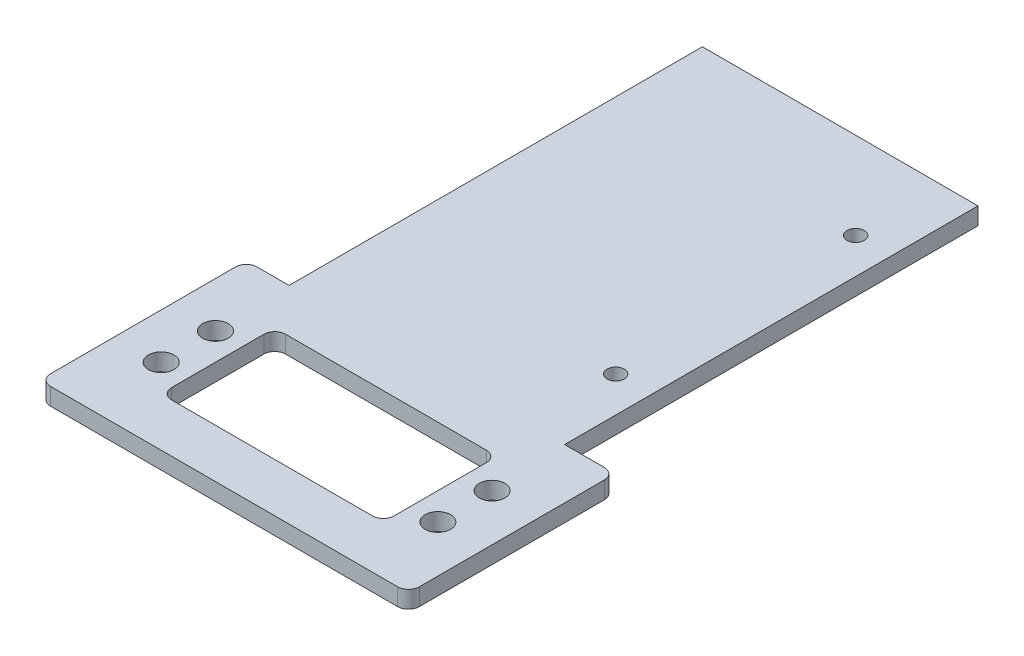
ISO-10303-21;
HEADER;
FILE_DESCRIPTION(('STEP AP214'),'2;1');
FILE_NAME('part.step','',(''),(''),'','','');
FILE_SCHEMA(('AUTOMOTIVE_DESIGN { 1 0 10303 214 1 1 1 1 }'));
ENDSEC;
DATA;
#1=APPLICATION_CONTEXT('core data for automotive mechanical design processes');
#2=APPLICATION_PROTOCOL_DEFINITION('international standard','automotive_design',2000,#1);
#3=PRODUCT_CONTEXT('',#1,'mechanical');
#4=PRODUCT('Part','Part','',(#3));
#5=PRODUCT_RELATED_PRODUCT_CATEGORY('part','',(#4));
#6=PRODUCT_DEFINITION_FORMATION('','',#4);
#7=PRODUCT_DEFINITION_CONTEXT('part definition',#1,'design');
#8=PRODUCT_DEFINITION('design','',#6,#7);
#9=PRODUCT_DEFINITION_SHAPE('','',#8);
#10=(LENGTH_UNIT() NAMED_UNIT(*) SI_UNIT(.MILLI.,.METRE.));
#11=(NAMED_UNIT(*) PLANE_ANGLE_UNIT() SI_UNIT($,.RADIAN.));
#12=(NAMED_UNIT(*) SI_UNIT($,.STERADIAN.) SOLID_ANGLE_UNIT());
#13=UNCERTAINTY_MEASURE_WITH_UNIT(LENGTH_MEASURE(1.E-05),#10,'distance_accuracy_value','');
#14=(GEOMETRIC_REPRESENTATION_CONTEXT(3) GLOBAL_UNCERTAINTY_ASSIGNED_CONTEXT((#13)) GLOBAL_UNIT_ASSIGNED_CONTEXT((#10,
#11,#12)) REPRESENTATION_CONTEXT('',''));
#15=CARTESIAN_POINT('',(0.,0.,0.));
#16=DIRECTION('',(0.,0.,1.));
#17=DIRECTION('',(1.,0.,0.));
#18=AXIS2_PLACEMENT_3D('',#15,#16,#17);
#19=CARTESIAN_POINT('',(-34.,3.175,19.05));
#20=DIRECTION('',(1.,0.,0.));
#21=DIRECTION('',(0.,0.,-1.));
#22=AXIS2_PLACEMENT_3D('',#19,#20,#21);
#23=PLANE('',#22);
#24=DIRECTION('',(0.,0.,1.));
#25=VECTOR('',#24,1.);
#26=CARTESIAN_POINT('',(-34.,3.175,19.05));
#27=LINE('',#26,#25);
#28=CARTESIAN_POINT('',(-34.,3.175,-17.05));
#29=VERTEX_POINT('',#28);
#30=CARTESIAN_POINT('',(-34.,3.175,17.05));
#31=VERTEX_POINT('',#30);
#32=EDGE_CURVE('E221',#29,#31,#27,.T.);
#33=ORIENTED_EDGE('',*,*,#32,.F.);
#34=DIRECTION('',(0.,-1.,0.));
#35=VECTOR('',#34,1.);
#36=CARTESIAN_POINT('',(-34.,3.175,-17.05));
#37=LINE('',#36,#35);
#38=CARTESIAN_POINT('',(-34.,0.,-17.05));
#39=VERTEX_POINT('',#38);
#40=EDGE_CURVE('E229',#29,#39,#37,.T.);
#41=ORIENTED_EDGE('',*,*,#40,.T.);
#42=DIRECTION('',(0.,0.,1.));
#43=VECTOR('',#42,1.);
#44=CARTESIAN_POINT('',(-34.,0.,19.05));
#45=LINE('',#44,#43);
#46=CARTESIAN_POINT('',(-34.,0.,17.05));
#47=VERTEX_POINT('',#46);
#48=EDGE_CURVE('E202',#39,#47,#45,.T.);
#49=ORIENTED_EDGE('',*,*,#48,.T.);
#50=DIRECTION('',(0.,-1.,0.));
#51=VECTOR('',#50,1.);
#52=CARTESIAN_POINT('',(-34.,3.175,17.05));
#53=LINE('',#52,#51);
#54=EDGE_CURVE('E186',#47,#31,#53,.F.);
#55=ORIENTED_EDGE('',*,*,#54,.T.);
#56=EDGE_LOOP('',(#33,#41,#49,#55));
#57=FACE_BOUND('',#56,.T.);
#58=ADVANCED_FACE('F32',(#57),#23,.F.);
#59=CARTESIAN_POINT('',(34.,3.175,19.05));
#60=DIRECTION('',(0.,0.,-1.));
#61=DIRECTION('',(-1.,0.,0.));
#62=AXIS2_PLACEMENT_3D('',#59,#60,#61);
#63=PLANE('',#62);
#64=DIRECTION('',(1.,0.,0.));
#65=VECTOR('',#64,1.);
#66=CARTESIAN_POINT('',(34.,0.,19.05));
#67=LINE('',#66,#65);
#68=CARTESIAN_POINT('',(-32.,0.,19.05));
#69=VERTEX_POINT('',#68);
#70=CARTESIAN_POINT('',(32.,0.,19.05));
#71=VERTEX_POINT('',#70);
#72=EDGE_CURVE('E205',#69,#71,#67,.T.);
#73=ORIENTED_EDGE('',*,*,#72,.T.);
#74=DIRECTION('',(0.,-1.,0.));
#75=VECTOR('',#74,1.);
#76=CARTESIAN_POINT('',(32.,3.175,19.05));
#77=LINE('',#76,#75);
#78=CARTESIAN_POINT('',(32.,3.175,19.05));
#79=VERTEX_POINT('',#78);
#80=EDGE_CURVE('E258',#71,#79,#77,.F.);
#81=ORIENTED_EDGE('',*,*,#80,.T.);
#82=DIRECTION('',(1.,0.,0.));
#83=VECTOR('',#82,1.);
#84=CARTESIAN_POINT('',(34.,3.175,19.05));
#85=LINE('',#84,#83);
#86=CARTESIAN_POINT('',(-32.,3.175,19.05));
#87=VERTEX_POINT('',#86);
#88=EDGE_CURVE('E353',#87,#79,#85,.T.);
#89=ORIENTED_EDGE('',*,*,#88,.F.);
#90=DIRECTION('',(0.,-1.,0.));
#91=VECTOR('',#90,1.);
#92=CARTESIAN_POINT('',(-32.,3.175,19.05));
#93=LINE('',#92,#91);
#94=EDGE_CURVE('E255',#87,#69,#93,.T.);
#95=ORIENTED_EDGE('',*,*,#94,.T.);
#96=EDGE_LOOP('',(#73,#81,#89,#95));
#97=FACE_BOUND('',#96,.T.);
#98=ADVANCED_FACE('F389',(#97),#63,.F.);
#99=CARTESIAN_POINT('',(34.,3.175,19.05));
#100=DIRECTION('',(-1.,0.,0.));
#101=DIRECTION('',(0.,0.,1.));
#102=AXIS2_PLACEMENT_3D('',#99,#100,#101);
#103=PLANE('',#102);
#104=DIRECTION('',(0.,0.,-1.));
#105=VECTOR('',#104,1.);
#106=CARTESIAN_POINT('',(34.,0.,19.05));
#107=LINE('',#106,#105);
#108=CARTESIAN_POINT('',(34.,0.,17.05));
#109=VERTEX_POINT('',#108);
#110=CARTESIAN_POINT('',(34.,0.,-17.05));
#111=VERTEX_POINT('',#110);
#112=EDGE_CURVE('E209',#109,#111,#107,.T.);
#113=ORIENTED_EDGE('',*,*,#112,.T.);
#114=DIRECTION('',(0.,-1.,0.));
#115=VECTOR('',#114,1.);
#116=CARTESIAN_POINT('',(34.,3.175,-17.05));
#117=LINE('',#116,#115);
#118=CARTESIAN_POINT('',(34.,3.175,-17.05));
#119=VERTEX_POINT('',#118);
#120=EDGE_CURVE('E55',#111,#119,#117,.F.);
#121=ORIENTED_EDGE('',*,*,#120,.T.);
#122=DIRECTION('',(0.,0.,-1.));
#123=VECTOR('',#122,1.);
#124=CARTESIAN_POINT('',(34.,3.175,19.05));
#125=LINE('',#124,#123);
#126=CARTESIAN_POINT('',(34.,3.175,17.05));
#127=VERTEX_POINT('',#126);
#128=EDGE_CURVE('E177',#127,#119,#125,.T.);
#129=ORIENTED_EDGE('',*,*,#128,.F.);
#130=DIRECTION('',(0.,-1.,0.));
#131=VECTOR('',#130,1.);
#132=CARTESIAN_POINT('',(34.,3.175,17.05));
#133=LINE('',#132,#131);
#134=EDGE_CURVE('E251',#127,#109,#133,.T.);
#135=ORIENTED_EDGE('',*,*,#134,.T.);
#136=EDGE_LOOP('',(#113,#121,#129,#135));
#137=FACE_BOUND('',#136,.T.);
#138=ADVANCED_FACE('F394',(#137),#103,.F.);
#139=CARTESIAN_POINT('',(34.,3.175,-19.05));
#140=DIRECTION('',(0.,0.,1.));
#141=DIRECTION('',(1.,0.,0.));
#142=AXIS2_PLACEMENT_3D('',#139,#140,#141);
#143=PLANE('',#142);
#144=DIRECTION('',(-1.,0.,0.));
#145=VECTOR('',#144,1.);
#146=CARTESIAN_POINT('',(34.,3.175,-19.05));
#147=LINE('',#146,#145);
#148=CARTESIAN_POINT('',(32.,3.175,-19.05));
#149=VERTEX_POINT('',#148);
#150=CARTESIAN_POINT('',(24.6845618434431,3.175,-19.05));
#151=VERTEX_POINT('',#150);
#152=EDGE_CURVE('E167',#149,#151,#147,.T.);
#153=ORIENTED_EDGE('',*,*,#152,.F.);
#154=DIRECTION('',(0.,-1.,0.));
#155=VECTOR('',#154,1.);
#156=CARTESIAN_POINT('',(32.,3.175,-19.05));
#157=LINE('',#156,#155);
#158=CARTESIAN_POINT('',(32.,0.,-19.05));
#159=VERTEX_POINT('',#158);
#160=EDGE_CURVE('E249',#149,#159,#157,.T.);
#161=ORIENTED_EDGE('',*,*,#160,.T.);
#162=DIRECTION('',(-1.,0.,0.));
#163=VECTOR('',#162,1.);
#164=CARTESIAN_POINT('',(34.,0.,-19.05));
#165=LINE('',#164,#163);
#166=CARTESIAN_POINT('',(24.6845618434431,0.,-19.05));
#167=VERTEX_POINT('',#166);
#168=EDGE_CURVE('E183',#159,#167,#165,.T.);
#169=ORIENTED_EDGE('',*,*,#168,.T.);
#170=DIRECTION('',(0.,-1.,0.));
#171=VECTOR('',#170,1.);
#172=CARTESIAN_POINT('',(24.6845618434431,3.175,-19.05));
#173=LINE('',#172,#171);
#174=EDGE_CURVE('E180',#151,#167,#173,.T.);
#175=ORIENTED_EDGE('',*,*,#174,.F.);
#176=EDGE_LOOP('',(#153,#161,#169,#175));
#177=FACE_BOUND('',#176,.T.);
#178=ADVANCED_FACE('F181',(#177),#143,.F.);
#179=CARTESIAN_POINT('',(24.6845618434431,3.175,-19.05));
#180=DIRECTION('',(-1.,0.,0.));
#181=DIRECTION('',(0.,0.,1.));
#182=AXIS2_PLACEMENT_3D('',#179,#180,#181);
#183=PLANE('',#182);
#184=DIRECTION('',(0.,0.,-1.));
#185=VECTOR('',#184,1.);
#186=CARTESIAN_POINT('',(24.6845618434431,0.,-19.05));
#187=LINE('',#186,#185);
#188=CARTESIAN_POINT('',(24.6845618434431,0.,-95.25));
#189=VERTEX_POINT('',#188);
#190=EDGE_CURVE('E212',#167,#189,#187,.T.);
#191=ORIENTED_EDGE('',*,*,#190,.T.);
#192=DIRECTION('',(0.,-1.,0.));
#193=VECTOR('',#192,1.);
#194=CARTESIAN_POINT('',(24.6845618434431,3.175,-95.25));
#195=LINE('',#194,#193);
#196=CARTESIAN_POINT('',(24.6845618434431,3.175,-95.25));
#197=VERTEX_POINT('',#196);
#198=EDGE_CURVE('E187',#197,#189,#195,.T.);
#199=ORIENTED_EDGE('',*,*,#198,.F.);
#200=DIRECTION('',(0.,0.,-1.));
#201=VECTOR('',#200,1.);
#202=CARTESIAN_POINT('',(24.6845618434431,3.175,-19.05));
#203=LINE('',#202,#201);
#204=EDGE_CURVE('E172',#151,#197,#203,.T.);
#205=ORIENTED_EDGE('',*,*,#204,.F.);
#206=ORIENTED_EDGE('',*,*,#174,.T.);
#207=EDGE_LOOP('',(#191,#199,#205,#206));
#208=FACE_BOUND('',#207,.T.);
#209=ADVANCED_FACE('F189',(#208),#183,.F.);
#210=CARTESIAN_POINT('',(-26.1154381565569,3.175,-95.25));
#211=DIRECTION('',(0.,0.,1.));
#212=DIRECTION('',(1.,0.,0.));
#213=AXIS2_PLACEMENT_3D('',#210,#211,#212);
#214=PLANE('',#213);
#215=DIRECTION('',(-1.,0.,0.));
#216=VECTOR('',#215,1.);
#217=CARTESIAN_POINT('',(-26.1154381565569,0.,-95.25));
#218=LINE('',#217,#216);
#219=CARTESIAN_POINT('',(-26.1154381565569,0.,-95.25));
#220=VERTEX_POINT('',#219);
#221=EDGE_CURVE('E214',#189,#220,#218,.T.);
#222=ORIENTED_EDGE('',*,*,#221,.T.);
#223=DIRECTION('',(0.,-1.,0.));
#224=VECTOR('',#223,1.);
#225=CARTESIAN_POINT('',(-26.1154381565569,3.175,-95.25));
#226=LINE('',#225,#224);
#227=CARTESIAN_POINT('',(-26.1154381565569,3.175,-95.25));
#228=VERTEX_POINT('',#227);
#229=EDGE_CURVE('E224',#228,#220,#226,.T.);
#230=ORIENTED_EDGE('',*,*,#229,.F.);
#231=DIRECTION('',(-1.,0.,0.));
#232=VECTOR('',#231,1.);
#233=CARTESIAN_POINT('',(-26.1154381565569,3.175,-95.25));
#234=LINE('',#233,#232);
#235=EDGE_CURVE('E192',#197,#228,#234,.T.);
#236=ORIENTED_EDGE('',*,*,#235,.F.);
#237=ORIENTED_EDGE('',*,*,#198,.T.);
#238=EDGE_LOOP('',(#222,#230,#236,#237));
#239=FACE_BOUND('',#238,.T.);
#240=ADVANCED_FACE('F365',(#239),#214,.F.);
#241=CARTESIAN_POINT('',(-26.1154381565569,3.175,-19.05));
#242=DIRECTION('',(1.,0.,0.));
#243=DIRECTION('',(0.,0.,-1.));
#244=AXIS2_PLACEMENT_3D('',#241,#242,#243);
#245=PLANE('',#244);
#246=DIRECTION('',(0.,0.,1.));
#247=VECTOR('',#246,1.);
#248=CARTESIAN_POINT('',(-26.1154381565569,0.,-19.05));
#249=LINE('',#248,#247);
#250=CARTESIAN_POINT('',(-26.1154381565569,0.,-19.05));
#251=VERTEX_POINT('',#250);
#252=EDGE_CURVE('E216',#220,#251,#249,.T.);
#253=ORIENTED_EDGE('',*,*,#252,.T.);
#254=DIRECTION('',(0.,-1.,0.));
#255=VECTOR('',#254,1.);
#256=CARTESIAN_POINT('',(-26.1154381565569,3.175,-19.05));
#257=LINE('',#256,#255);
#258=CARTESIAN_POINT('',(-26.1154381565569,3.175,-19.05));
#259=VERTEX_POINT('',#258);
#260=EDGE_CURVE('E201',#259,#251,#257,.T.);
#261=ORIENTED_EDGE('',*,*,#260,.F.);
#262=DIRECTION('',(0.,0.,1.));
#263=VECTOR('',#262,1.);
#264=CARTESIAN_POINT('',(-26.1154381565569,3.175,-19.05));
#265=LINE('',#264,#263);
#266=EDGE_CURVE('E194',#228,#259,#265,.T.);
#267=ORIENTED_EDGE('',*,*,#266,.F.);
#268=ORIENTED_EDGE('',*,*,#229,.T.);
#269=EDGE_LOOP('',(#253,#261,#267,#268));
#270=FACE_BOUND('',#269,.T.);
#271=ADVANCED_FACE('F372',(#270),#245,.F.);
#272=CARTESIAN_POINT('',(-26.1154381565569,3.175,-19.05));
#273=DIRECTION('',(0.,0.,1.));
#274=DIRECTION('',(1.,0.,0.));
#275=AXIS2_PLACEMENT_3D('',#272,#273,#274);
#276=PLANE('',#275);
#277=DIRECTION('',(-1.,0.,0.));
#278=VECTOR('',#277,1.);
#279=CARTESIAN_POINT('',(-26.1154381565569,0.,-19.05));
#280=LINE('',#279,#278);
#281=CARTESIAN_POINT('',(-32.,0.,-19.05));
#282=VERTEX_POINT('',#281);
#283=EDGE_CURVE('E218',#251,#282,#280,.T.);
#284=ORIENTED_EDGE('',*,*,#283,.T.);
#285=DIRECTION('',(0.,-1.,0.));
#286=VECTOR('',#285,1.);
#287=CARTESIAN_POINT('',(-32.,3.175,-19.05));
#288=LINE('',#287,#286);
#289=CARTESIAN_POINT('',(-32.,3.175,-19.05));
#290=VERTEX_POINT('',#289);
#291=EDGE_CURVE('E240',#282,#290,#288,.F.);
#292=ORIENTED_EDGE('',*,*,#291,.T.);
#293=DIRECTION('',(-1.,0.,0.));
#294=VECTOR('',#293,1.);
#295=CARTESIAN_POINT('',(-26.1154381565569,3.175,-19.05));
#296=LINE('',#295,#294);
#297=EDGE_CURVE('E199',#259,#290,#296,.T.);
#298=ORIENTED_EDGE('',*,*,#297,.F.);
#299=ORIENTED_EDGE('',*,*,#260,.T.);
#300=EDGE_LOOP('',(#284,#292,#298,#299));
#301=FACE_BOUND('',#300,.T.);
#302=ADVANCED_FACE('F375',(#301),#276,.F.);
#303=CARTESIAN_POINT('',(0.,3.175,0.));
#304=DIRECTION('',(0.,1.,0.));
#305=DIRECTION('',(0.,0.,1.));
#306=AXIS2_PLACEMENT_3D('',#303,#304,#305);
#307=PLANE('',#306);
#308=CARTESIAN_POINT('',(18.1345618434431,3.175,-79.248));
#309=DIRECTION('',(0.,1.,0.));
#310=DIRECTION('',(0.,0.,1.));
#311=AXIS2_PLACEMENT_3D('',#308,#309,#310);
#312=CIRCLE('',#311,1.5875);
#313=CARTESIAN_POINT('',(18.1345618434431,3.175,-77.6605));
#314=VERTEX_POINT('',#313);
#315=EDGE_CURVE('E617',#314,#314,#312,.T.);
#316=ORIENTED_EDGE('',*,*,#315,.F.);
#317=EDGE_LOOP('',(#316));
#318=FACE_BOUND('',#317,.T.);
#319=CARTESIAN_POINT('',(18.1345618434431,3.175,-34.998));
#320=DIRECTION('',(0.,1.,0.));
#321=DIRECTION('',(0.,0.,1.));
#322=AXIS2_PLACEMENT_3D('',#319,#320,#321);
#323=CIRCLE('',#322,1.5875);
#324=CARTESIAN_POINT('',(18.1345618434431,3.175,-33.4105));
#325=VERTEX_POINT('',#324);
#326=EDGE_CURVE('E622',#325,#325,#323,.T.);
#327=ORIENTED_EDGE('',*,*,#326,.F.);
#328=EDGE_LOOP('',(#327));
#329=FACE_BOUND('',#328,.T.);
#330=DIRECTION('',(0.,0.,1.));
#331=VECTOR('',#330,1.);
#332=CARTESIAN_POINT('',(-20.6404381565569,3.175,10.0597366167731));
#333=LINE('',#332,#331);
#334=CARTESIAN_POINT('',(-20.6404381565569,3.175,-8.94026338322691));
#335=VERTEX_POINT('',#334);
#336=CARTESIAN_POINT('',(-20.6404381565569,3.175,8.05973661677308));
#337=VERTEX_POINT('',#336);
#338=EDGE_CURVE('E298',#335,#337,#333,.T.);
#339=ORIENTED_EDGE('',*,*,#338,.F.);
#340=CARTESIAN_POINT('',(-18.6404381565569,3.175,-8.94026338322692));
#341=DIRECTION('',(0.,1.,0.));
#342=DIRECTION('',(0.,0.,1.));
#343=AXIS2_PLACEMENT_3D('',#340,#341,#342);
#344=CIRCLE('',#343,2.);
#345=CARTESIAN_POINT('',(-18.6404381565569,3.175,-10.9402633832269));
#346=VERTEX_POINT('',#345);
#347=EDGE_CURVE('E40',#335,#346,#344,.F.);
#348=ORIENTED_EDGE('',*,*,#347,.T.);
#349=DIRECTION('',(-1.,0.,0.));
#350=VECTOR('',#349,1.);
#351=CARTESIAN_POINT('',(20.3595618434431,3.175,-10.9402633832269));
#352=LINE('',#351,#350);
#353=CARTESIAN_POINT('',(18.3595618434431,3.175,-10.9402633832269));
#354=VERTEX_POINT('',#353);
#355=EDGE_CURVE('E296',#354,#346,#352,.T.);
#356=ORIENTED_EDGE('',*,*,#355,.F.);
#357=CARTESIAN_POINT('',(18.3595618434431,3.175,-8.94026338322692));
#358=DIRECTION('',(0.,1.,0.));
#359=DIRECTION('',(0.,0.,1.));
#360=AXIS2_PLACEMENT_3D('',#357,#358,#359);
#361=CIRCLE('',#360,2.);
#362=CARTESIAN_POINT('',(20.3595618434431,3.175,-8.94026338322692));
#363=VERTEX_POINT('',#362);
#364=EDGE_CURVE('E280',#354,#363,#361,.F.);
#365=ORIENTED_EDGE('',*,*,#364,.T.);
#366=DIRECTION('',(0.,0.,-1.));
#367=VECTOR('',#366,1.);
#368=CARTESIAN_POINT('',(20.3595618434431,3.175,10.0597366167731));
#369=LINE('',#368,#367);
#370=CARTESIAN_POINT('',(20.3595618434431,3.175,8.05973661677308));
#371=VERTEX_POINT('',#370);
#372=EDGE_CURVE('E308',#371,#363,#369,.T.);
#373=ORIENTED_EDGE('',*,*,#372,.F.);
#374=CARTESIAN_POINT('',(18.3595618434431,3.175,8.05973661677308));
#375=DIRECTION('',(0.,1.,0.));
#376=DIRECTION('',(0.,0.,1.));
#377=AXIS2_PLACEMENT_3D('',#374,#375,#376);
#378=CIRCLE('',#377,2.);
#379=CARTESIAN_POINT('',(18.3595618434431,3.175,10.0597366167731));
#380=VERTEX_POINT('',#379);
#381=EDGE_CURVE('E284',#371,#380,#378,.F.);
#382=ORIENTED_EDGE('',*,*,#381,.T.);
#383=DIRECTION('',(1.,0.,0.));
#384=VECTOR('',#383,1.);
#385=CARTESIAN_POINT('',(20.3595618434431,3.175,10.0597366167731));
#386=LINE('',#385,#384);
#387=CARTESIAN_POINT('',(-18.6404381565569,3.175,10.0597366167731));
#388=VERTEX_POINT('',#387);
#389=EDGE_CURVE('E335',#388,#380,#386,.T.);
#390=ORIENTED_EDGE('',*,*,#389,.F.);
#391=CARTESIAN_POINT('',(-18.6404381565569,3.175,8.05973661677308));
#392=DIRECTION('',(0.,1.,0.));
#393=DIRECTION('',(0.,0.,1.));
#394=AXIS2_PLACEMENT_3D('',#391,#392,#393);
#395=CIRCLE('',#394,2.);
#396=EDGE_CURVE('E288',#388,#337,#395,.F.);
#397=ORIENTED_EDGE('',*,*,#396,.T.);
#398=EDGE_LOOP('',(#339,#348,#356,#365,#373,#382,#390,#397));
#399=FACE_BOUND('',#398,.T.);
#400=CARTESIAN_POINT('',(25.3595618434431,3.175,5.));
#401=DIRECTION('',(0.,1.,0.));
#402=DIRECTION('',(0.,0.,-1.));
#403=AXIS2_PLACEMENT_3D('',#400,#401,#402);
#404=CIRCLE('',#403,2.35);
#405=CARTESIAN_POINT('',(25.3595618434431,3.175,2.65));
#406=VERTEX_POINT('',#405);
#407=EDGE_CURVE('E343',#406,#406,#404,.T.);
#408=ORIENTED_EDGE('',*,*,#407,.F.);
#409=EDGE_LOOP('',(#408));
#410=FACE_BOUND('',#409,.T.);
#411=CARTESIAN_POINT('',(-25.6404381565569,3.175,-5.));
#412=DIRECTION('',(0.,1.,0.));
#413=DIRECTION('',(0.,0.,1.));
#414=AXIS2_PLACEMENT_3D('',#411,#412,#413);
#415=CIRCLE('',#414,2.35);
#416=CARTESIAN_POINT('',(-25.6404381565569,3.175,-2.65));
#417=VERTEX_POINT('',#416);
#418=EDGE_CURVE('E629',#417,#417,#415,.T.);
#419=ORIENTED_EDGE('',*,*,#418,.F.);
#420=EDGE_LOOP('',(#419));
#421=FACE_BOUND('',#420,.T.);
#422=CARTESIAN_POINT('',(25.3595618434431,3.175,-5.));
#423=DIRECTION('',(0.,1.,0.));
#424=DIRECTION('',(0.,0.,-1.));
#425=AXIS2_PLACEMENT_3D('',#422,#423,#424);
#426=CIRCLE('',#425,2.35);
#427=CARTESIAN_POINT('',(25.3595618434431,3.175,-7.35));
#428=VERTEX_POINT('',#427);
#429=EDGE_CURVE('E328',#428,#428,#426,.T.);
#430=ORIENTED_EDGE('',*,*,#429,.F.);
#431=EDGE_LOOP('',(#430));
#432=FACE_BOUND('',#431,.T.);
#433=CARTESIAN_POINT('',(-25.6404381565569,3.175,5.));
#434=DIRECTION('',(0.,1.,0.));
#435=DIRECTION('',(0.,0.,1.));
#436=AXIS2_PLACEMENT_3D('',#433,#434,#435);
#437=CIRCLE('',#436,2.35);
#438=CARTESIAN_POINT('',(-25.6404381565569,3.175,7.35));
#439=VERTEX_POINT('',#438);
#440=EDGE_CURVE('E333',#439,#439,#437,.T.);
#441=ORIENTED_EDGE('',*,*,#440,.F.);
#442=EDGE_LOOP('',(#441));
#443=FACE_BOUND('',#442,.T.);
#444=ORIENTED_EDGE('',*,*,#297,.T.);
#445=CARTESIAN_POINT('',(-32.,3.175,-17.05));
#446=DIRECTION('',(0.,1.,0.));
#447=DIRECTION('',(0.,0.,1.));
#448=AXIS2_PLACEMENT_3D('',#445,#446,#447);
#449=CIRCLE('',#448,2.);
#450=EDGE_CURVE('E247',#290,#29,#449,.T.);
#451=ORIENTED_EDGE('',*,*,#450,.T.);
#452=ORIENTED_EDGE('',*,*,#32,.T.);
#453=CARTESIAN_POINT('',(-32.,3.175,17.05));
#454=DIRECTION('',(0.,1.,0.));
#455=DIRECTION('',(0.,0.,1.));
#456=AXIS2_PLACEMENT_3D('',#453,#454,#455);
#457=CIRCLE('',#456,2.);
#458=EDGE_CURVE('E242',#31,#87,#457,.T.);
#459=ORIENTED_EDGE('',*,*,#458,.T.);
#460=ORIENTED_EDGE('',*,*,#88,.T.);
#461=CARTESIAN_POINT('',(32.,3.175,17.05));
#462=DIRECTION('',(0.,1.,0.));
#463=DIRECTION('',(0.,0.,1.));
#464=AXIS2_PLACEMENT_3D('',#461,#462,#463);
#465=CIRCLE('',#464,2.);
#466=EDGE_CURVE('E244',#79,#127,#465,.T.);
#467=ORIENTED_EDGE('',*,*,#466,.T.);
#468=ORIENTED_EDGE('',*,*,#128,.T.);
#469=CARTESIAN_POINT('',(32.,3.175,-17.05));
#470=DIRECTION('',(0.,1.,0.));
#471=DIRECTION('',(0.,0.,1.));
#472=AXIS2_PLACEMENT_3D('',#469,#470,#471);
#473=CIRCLE('',#472,2.);
#474=EDGE_CURVE('E47',#119,#149,#473,.T.);
#475=ORIENTED_EDGE('',*,*,#474,.T.);
#476=ORIENTED_EDGE('',*,*,#152,.T.);
#477=ORIENTED_EDGE('',*,*,#204,.T.);
#478=ORIENTED_EDGE('',*,*,#235,.T.);
#479=ORIENTED_EDGE('',*,*,#266,.T.);
#480=EDGE_LOOP('',(#444,#451,#452,#459,#460,#467,#468,#475,#476,#477,#478,#479));
#481=FACE_BOUND('',#480,.T.);
#482=ADVANCED_FACE('F170',(#318,#329,#399,#410,#421,#432,#443,#481),#307,.T.);
#483=CARTESIAN_POINT('',(0.,0.,0.));
#484=DIRECTION('',(0.,1.,0.));
#485=DIRECTION('',(0.,0.,1.));
#486=AXIS2_PLACEMENT_3D('',#483,#484,#485);
#487=PLANE('',#486);
#488=CARTESIAN_POINT('',(18.1345618434431,0.,-79.248));
#489=DIRECTION('',(0.,1.,0.));
#490=DIRECTION('',(0.,0.,1.));
#491=AXIS2_PLACEMENT_3D('',#488,#489,#490);
#492=CIRCLE('',#491,1.5875);
#493=CARTESIAN_POINT('',(18.1345618434431,0.,-77.6605));
#494=VERTEX_POINT('',#493);
#495=EDGE_CURVE('E614',#494,#494,#492,.T.);
#496=ORIENTED_EDGE('',*,*,#495,.T.);
#497=EDGE_LOOP('',(#496));
#498=FACE_BOUND('',#497,.T.);
#499=CARTESIAN_POINT('',(18.1345618434431,0.,-34.998));
#500=DIRECTION('',(0.,1.,0.));
#501=DIRECTION('',(0.,0.,1.));
#502=AXIS2_PLACEMENT_3D('',#499,#500,#501);
#503=CIRCLE('',#502,1.5875);
#504=CARTESIAN_POINT('',(18.1345618434431,0.,-33.4105));
#505=VERTEX_POINT('',#504);
#506=EDGE_CURVE('E618',#505,#505,#503,.T.);
#507=ORIENTED_EDGE('',*,*,#506,.T.);
#508=EDGE_LOOP('',(#507));
#509=FACE_BOUND('',#508,.T.);
#510=DIRECTION('',(0.,0.,-1.));
#511=VECTOR('',#510,1.);
#512=CARTESIAN_POINT('',(20.3595618434431,0.,10.0597366167731));
#513=LINE('',#512,#511);
#514=CARTESIAN_POINT('',(20.3595618434431,0.,8.05973661677308));
#515=VERTEX_POINT('',#514);
#516=CARTESIAN_POINT('',(20.3595618434431,0.,-8.94026338322692));
#517=VERTEX_POINT('',#516);
#518=EDGE_CURVE('E325',#515,#517,#513,.T.);
#519=ORIENTED_EDGE('',*,*,#518,.T.);
#520=CARTESIAN_POINT('',(18.3595618434431,0.,-8.94026338322692));
#521=DIRECTION('',(0.,1.,0.));
#522=DIRECTION('',(0.,0.,1.));
#523=AXIS2_PLACEMENT_3D('',#520,#521,#522);
#524=CIRCLE('',#523,2.);
#525=CARTESIAN_POINT('',(18.3595618434431,0.,-10.9402633832269));
#526=VERTEX_POINT('',#525);
#527=EDGE_CURVE('E282',#517,#526,#524,.T.);
#528=ORIENTED_EDGE('',*,*,#527,.T.);
#529=DIRECTION('',(-1.,0.,0.));
#530=VECTOR('',#529,1.);
#531=CARTESIAN_POINT('',(20.3595618434431,0.,-10.9402633832269));
#532=LINE('',#531,#530);
#533=CARTESIAN_POINT('',(-18.6404381565569,0.,-10.9402633832269));
#534=VERTEX_POINT('',#533);
#535=EDGE_CURVE('E318',#526,#534,#532,.T.);
#536=ORIENTED_EDGE('',*,*,#535,.T.);
#537=CARTESIAN_POINT('',(-18.6404381565569,0.,-8.94026338322692));
#538=DIRECTION('',(0.,1.,0.));
#539=DIRECTION('',(0.,0.,1.));
#540=AXIS2_PLACEMENT_3D('',#537,#538,#539);
#541=CIRCLE('',#540,2.);
#542=CARTESIAN_POINT('',(-20.6404381565569,0.,-8.94026338322691));
#543=VERTEX_POINT('',#542);
#544=EDGE_CURVE('E11',#534,#543,#541,.T.);
#545=ORIENTED_EDGE('',*,*,#544,.T.);
#546=DIRECTION('',(0.,0.,1.));
#547=VECTOR('',#546,1.);
#548=CARTESIAN_POINT('',(-20.6404381565569,0.,10.0597366167731));
#549=LINE('',#548,#547);
#550=CARTESIAN_POINT('',(-20.6404381565569,0.,8.05973661677308));
#551=VERTEX_POINT('',#550);
#552=EDGE_CURVE('E307',#543,#551,#549,.T.);
#553=ORIENTED_EDGE('',*,*,#552,.T.);
#554=CARTESIAN_POINT('',(-18.6404381565569,0.,8.05973661677308));
#555=DIRECTION('',(0.,1.,0.));
#556=DIRECTION('',(0.,0.,1.));
#557=AXIS2_PLACEMENT_3D('',#554,#555,#556);
#558=CIRCLE('',#557,2.);
#559=CARTESIAN_POINT('',(-18.6404381565569,0.,10.0597366167731));
#560=VERTEX_POINT('',#559);
#561=EDGE_CURVE('E290',#551,#560,#558,.T.);
#562=ORIENTED_EDGE('',*,*,#561,.T.);
#563=DIRECTION('',(1.,0.,0.));
#564=VECTOR('',#563,1.);
#565=CARTESIAN_POINT('',(20.3595618434431,0.,10.0597366167731));
#566=LINE('',#565,#564);
#567=CARTESIAN_POINT('',(18.3595618434431,0.,10.0597366167731));
#568=VERTEX_POINT('',#567);
#569=EDGE_CURVE('E322',#560,#568,#566,.T.);
#570=ORIENTED_EDGE('',*,*,#569,.T.);
#571=CARTESIAN_POINT('',(18.3595618434431,0.,8.05973661677308));
#572=DIRECTION('',(0.,1.,0.));
#573=DIRECTION('',(0.,0.,1.));
#574=AXIS2_PLACEMENT_3D('',#571,#572,#573);
#575=CIRCLE('',#574,2.);
#576=EDGE_CURVE('E286',#568,#515,#575,.T.);
#577=ORIENTED_EDGE('',*,*,#576,.T.);
#578=EDGE_LOOP('',(#519,#528,#536,#545,#553,#562,#570,#577));
#579=FACE_BOUND('',#578,.T.);
#580=CARTESIAN_POINT('',(25.3595618434431,0.,5.));
#581=DIRECTION('',(0.,1.,0.));
#582=DIRECTION('',(0.,0.,-1.));
#583=AXIS2_PLACEMENT_3D('',#580,#581,#582);
#584=CIRCLE('',#583,2.35);
#585=CARTESIAN_POINT('',(25.3595618434431,0.,2.65));
#586=VERTEX_POINT('',#585);
#587=EDGE_CURVE('E336',#586,#586,#584,.T.);
#588=ORIENTED_EDGE('',*,*,#587,.T.);
#589=EDGE_LOOP('',(#588));
#590=FACE_BOUND('',#589,.T.);
#591=CARTESIAN_POINT('',(-25.6404381565569,0.,-5.));
#592=DIRECTION('',(0.,1.,0.));
#593=DIRECTION('',(0.,0.,1.));
#594=AXIS2_PLACEMENT_3D('',#591,#592,#593);
#595=CIRCLE('',#594,2.35);
#596=CARTESIAN_POINT('',(-25.6404381565569,0.,-2.65));
#597=VERTEX_POINT('',#596);
#598=EDGE_CURVE('E346',#597,#597,#595,.T.);
#599=ORIENTED_EDGE('',*,*,#598,.T.);
#600=EDGE_LOOP('',(#599));
#601=FACE_BOUND('',#600,.T.);
#602=CARTESIAN_POINT('',(25.3595618434431,0.,-5.));
#603=DIRECTION('',(0.,1.,0.));
#604=DIRECTION('',(0.,0.,-1.));
#605=AXIS2_PLACEMENT_3D('',#602,#603,#604);
#606=CIRCLE('',#605,2.35);
#607=CARTESIAN_POINT('',(25.3595618434431,0.,-7.35));
#608=VERTEX_POINT('',#607);
#609=EDGE_CURVE('E631',#608,#608,#606,.T.);
#610=ORIENTED_EDGE('',*,*,#609,.T.);
#611=EDGE_LOOP('',(#610));
#612=FACE_BOUND('',#611,.T.);
#613=CARTESIAN_POINT('',(-25.6404381565569,0.,5.));
#614=DIRECTION('',(0.,1.,0.));
#615=DIRECTION('',(0.,0.,1.));
#616=AXIS2_PLACEMENT_3D('',#613,#614,#615);
#617=CIRCLE('',#616,2.35);
#618=CARTESIAN_POINT('',(-25.6404381565569,0.,7.35));
#619=VERTEX_POINT('',#618);
#620=EDGE_CURVE('E206',#619,#619,#617,.T.);
#621=ORIENTED_EDGE('',*,*,#620,.T.);
#622=EDGE_LOOP('',(#621));
#623=FACE_BOUND('',#622,.T.);
#624=ORIENTED_EDGE('',*,*,#48,.F.);
#625=CARTESIAN_POINT('',(-32.,0.,-17.05));
#626=DIRECTION('',(0.,1.,0.));
#627=DIRECTION('',(0.,0.,1.));
#628=AXIS2_PLACEMENT_3D('',#625,#626,#627);
#629=CIRCLE('',#628,2.);
#630=EDGE_CURVE('E238',#39,#282,#629,.F.);
#631=ORIENTED_EDGE('',*,*,#630,.T.);
#632=ORIENTED_EDGE('',*,*,#283,.F.);
#633=ORIENTED_EDGE('',*,*,#252,.F.);
#634=ORIENTED_EDGE('',*,*,#221,.F.);
#635=ORIENTED_EDGE('',*,*,#190,.F.);
#636=ORIENTED_EDGE('',*,*,#168,.F.);
#637=CARTESIAN_POINT('',(32.,0.,-17.05));
#638=DIRECTION('',(0.,1.,0.));
#639=DIRECTION('',(0.,0.,1.));
#640=AXIS2_PLACEMENT_3D('',#637,#638,#639);
#641=CIRCLE('',#640,2.);
#642=EDGE_CURVE('E236',#159,#111,#641,.F.);
#643=ORIENTED_EDGE('',*,*,#642,.T.);
#644=ORIENTED_EDGE('',*,*,#112,.F.);
#645=CARTESIAN_POINT('',(32.,0.,17.05));
#646=DIRECTION('',(0.,1.,0.));
#647=DIRECTION('',(0.,0.,1.));
#648=AXIS2_PLACEMENT_3D('',#645,#646,#647);
#649=CIRCLE('',#648,2.);
#650=EDGE_CURVE('E234',#109,#71,#649,.F.);
#651=ORIENTED_EDGE('',*,*,#650,.T.);
#652=ORIENTED_EDGE('',*,*,#72,.F.);
#653=CARTESIAN_POINT('',(-32.,0.,17.05));
#654=DIRECTION('',(0.,1.,0.));
#655=DIRECTION('',(0.,0.,1.));
#656=AXIS2_PLACEMENT_3D('',#653,#654,#655);
#657=CIRCLE('',#656,2.);
#658=EDGE_CURVE('E232',#69,#47,#657,.F.);
#659=ORIENTED_EDGE('',*,*,#658,.T.);
#660=EDGE_LOOP('',(#624,#631,#632,#633,#634,#635,#636,#643,#644,#651,#652,#659));
#661=FACE_BOUND('',#660,.T.);
#662=ADVANCED_FACE('F315',(#498,#509,#579,#590,#601,#612,#623,#661),#487,.F.);
#663=CARTESIAN_POINT('',(-25.6404381565569,0.,5.));
#664=DIRECTION('',(0.,1.,0.));
#665=DIRECTION('',(0.,0.,1.));
#666=AXIS2_PLACEMENT_3D('',#663,#664,#665);
#667=CYLINDRICAL_SURFACE('',#666,2.35);
#668=ORIENTED_EDGE('',*,*,#620,.F.);
#669=EDGE_LOOP('',(#668));
#670=FACE_BOUND('',#669,.T.);
#671=ORIENTED_EDGE('',*,*,#440,.T.);
#672=EDGE_LOOP('',(#671));
#673=FACE_BOUND('',#672,.T.);
#674=ADVANCED_FACE('F461',(#670,#673),#667,.F.);
#675=CARTESIAN_POINT('',(25.3595618434431,0.,-5.));
#676=DIRECTION('',(0.,1.,0.));
#677=DIRECTION('',(0.,0.,1.));
#678=AXIS2_PLACEMENT_3D('',#675,#676,#677);
#679=CYLINDRICAL_SURFACE('',#678,2.35);
#680=ORIENTED_EDGE('',*,*,#609,.F.);
#681=EDGE_LOOP('',(#680));
#682=FACE_BOUND('',#681,.T.);
#683=ORIENTED_EDGE('',*,*,#429,.T.);
#684=EDGE_LOOP('',(#683));
#685=FACE_BOUND('',#684,.T.);
#686=ADVANCED_FACE('F464',(#682,#685),#679,.F.);
#687=CARTESIAN_POINT('',(-25.6404381565569,0.,-5.));
#688=DIRECTION('',(0.,1.,0.));
#689=DIRECTION('',(0.,0.,1.));
#690=AXIS2_PLACEMENT_3D('',#687,#688,#689);
#691=CYLINDRICAL_SURFACE('',#690,2.35);
#692=ORIENTED_EDGE('',*,*,#598,.F.);
#693=EDGE_LOOP('',(#692));
#694=FACE_BOUND('',#693,.T.);
#695=ORIENTED_EDGE('',*,*,#418,.T.);
#696=EDGE_LOOP('',(#695));
#697=FACE_BOUND('',#696,.T.);
#698=ADVANCED_FACE('F459',(#694,#697),#691,.F.);
#699=CARTESIAN_POINT('',(25.3595618434431,0.,5.));
#700=DIRECTION('',(0.,1.,0.));
#701=DIRECTION('',(0.,0.,1.));
#702=AXIS2_PLACEMENT_3D('',#699,#700,#701);
#703=CYLINDRICAL_SURFACE('',#702,2.35);
#704=ORIENTED_EDGE('',*,*,#587,.F.);
#705=EDGE_LOOP('',(#704));
#706=FACE_BOUND('',#705,.T.);
#707=ORIENTED_EDGE('',*,*,#407,.T.);
#708=EDGE_LOOP('',(#707));
#709=FACE_BOUND('',#708,.T.);
#710=ADVANCED_FACE('F456',(#706,#709),#703,.F.);
#711=CARTESIAN_POINT('',(-20.6404381565569,0.,10.0597366167731));
#712=DIRECTION('',(-1.,0.,0.));
#713=DIRECTION('',(0.,0.,1.));
#714=AXIS2_PLACEMENT_3D('',#711,#712,#713);
#715=PLANE('',#714);
#716=ORIENTED_EDGE('',*,*,#338,.T.);
#717=DIRECTION('',(0.,1.,0.));
#718=VECTOR('',#717,1.);
#719=CARTESIAN_POINT('',(-20.6404381565569,0.,8.05973661677308));
#720=LINE('',#719,#718);
#721=EDGE_CURVE('E278',#337,#551,#720,.F.);
#722=ORIENTED_EDGE('',*,*,#721,.T.);
#723=ORIENTED_EDGE('',*,*,#552,.F.);
#724=DIRECTION('',(0.,1.,0.));
#725=VECTOR('',#724,1.);
#726=CARTESIAN_POINT('',(-20.6404381565569,3.175,-8.94026338322692));
#727=LINE('',#726,#725);
#728=EDGE_CURVE('E275',#543,#335,#727,.T.);
#729=ORIENTED_EDGE('',*,*,#728,.T.);
#730=EDGE_LOOP('',(#716,#722,#723,#729));
#731=FACE_BOUND('',#730,.T.);
#732=ADVANCED_FACE('F320',(#731),#715,.F.);
#733=CARTESIAN_POINT('',(20.3595618434431,0.,-10.9402633832269));
#734=DIRECTION('',(0.,0.,-1.));
#735=DIRECTION('',(-1.,0.,0.));
#736=AXIS2_PLACEMENT_3D('',#733,#734,#735);
#737=PLANE('',#736);
#738=ORIENTED_EDGE('',*,*,#535,.F.);
#739=DIRECTION('',(0.,1.,0.));
#740=VECTOR('',#739,1.);
#741=CARTESIAN_POINT('',(18.3595618434431,3.175,-10.9402633832269));
#742=LINE('',#741,#740);
#743=EDGE_CURVE('E262',#526,#354,#742,.T.);
#744=ORIENTED_EDGE('',*,*,#743,.T.);
#745=ORIENTED_EDGE('',*,*,#355,.T.);
#746=DIRECTION('',(0.,1.,0.));
#747=VECTOR('',#746,1.);
#748=CARTESIAN_POINT('',(-18.6404381565569,0.,-10.9402633832269));
#749=LINE('',#748,#747);
#750=EDGE_CURVE('E260',#346,#534,#749,.F.);
#751=ORIENTED_EDGE('',*,*,#750,.T.);
#752=EDGE_LOOP('',(#738,#744,#745,#751));
#753=FACE_BOUND('',#752,.T.);
#754=ADVANCED_FACE('F304',(#753),#737,.F.);
#755=CARTESIAN_POINT('',(20.3595618434431,0.,10.0597366167731));
#756=DIRECTION('',(1.,0.,0.));
#757=DIRECTION('',(0.,0.,-1.));
#758=AXIS2_PLACEMENT_3D('',#755,#756,#757);
#759=PLANE('',#758);
#760=ORIENTED_EDGE('',*,*,#372,.T.);
#761=DIRECTION('',(0.,1.,0.));
#762=VECTOR('',#761,1.);
#763=CARTESIAN_POINT('',(20.3595618434431,0.,-8.94026338322692));
#764=LINE('',#763,#762);
#765=EDGE_CURVE('E268',#363,#517,#764,.F.);
#766=ORIENTED_EDGE('',*,*,#765,.T.);
#767=ORIENTED_EDGE('',*,*,#518,.F.);
#768=DIRECTION('',(0.,1.,0.));
#769=VECTOR('',#768,1.);
#770=CARTESIAN_POINT('',(20.3595618434431,3.175,8.05973661677308));
#771=LINE('',#770,#769);
#772=EDGE_CURVE('E265',#515,#371,#771,.T.);
#773=ORIENTED_EDGE('',*,*,#772,.T.);
#774=EDGE_LOOP('',(#760,#766,#767,#773));
#775=FACE_BOUND('',#774,.T.);
#776=ADVANCED_FACE('F441',(#775),#759,.F.);
#777=CARTESIAN_POINT('',(20.3595618434431,0.,10.0597366167731));
#778=DIRECTION('',(0.,0.,1.));
#779=DIRECTION('',(1.,0.,0.));
#780=AXIS2_PLACEMENT_3D('',#777,#778,#779);
#781=PLANE('',#780);
#782=ORIENTED_EDGE('',*,*,#389,.T.);
#783=DIRECTION('',(0.,1.,0.));
#784=VECTOR('',#783,1.);
#785=CARTESIAN_POINT('',(18.3595618434431,0.,10.0597366167731));
#786=LINE('',#785,#784);
#787=EDGE_CURVE('E273',#380,#568,#786,.F.);
#788=ORIENTED_EDGE('',*,*,#787,.T.);
#789=ORIENTED_EDGE('',*,*,#569,.F.);
#790=DIRECTION('',(0.,1.,0.));
#791=VECTOR('',#790,1.);
#792=CARTESIAN_POINT('',(-18.6404381565569,3.175,10.0597366167731));
#793=LINE('',#792,#791);
#794=EDGE_CURVE('E270',#560,#388,#793,.T.);
#795=ORIENTED_EDGE('',*,*,#794,.T.);
#796=EDGE_LOOP('',(#782,#788,#789,#795));
#797=FACE_BOUND('',#796,.T.);
#798=ADVANCED_FACE('F410',(#797),#781,.F.);
#799=CARTESIAN_POINT('',(-32.,3.175,-17.05));
#800=DIRECTION('',(0.,-1.,0.));
#801=DIRECTION('',(0.,0.,-1.));
#802=AXIS2_PLACEMENT_3D('',#799,#800,#801);
#803=CYLINDRICAL_SURFACE('',#802,2.);
#804=ORIENTED_EDGE('',*,*,#450,.F.);
#805=ORIENTED_EDGE('',*,*,#291,.F.);
#806=ORIENTED_EDGE('',*,*,#630,.F.);
#807=ORIENTED_EDGE('',*,*,#40,.F.);
#808=EDGE_LOOP('',(#804,#805,#806,#807));
#809=FACE_BOUND('',#808,.T.);
#810=ADVANCED_FACE('F378',(#809),#803,.T.);
#811=CARTESIAN_POINT('',(32.,3.175,-17.05));
#812=DIRECTION('',(0.,-1.,0.));
#813=DIRECTION('',(0.,0.,-1.));
#814=AXIS2_PLACEMENT_3D('',#811,#812,#813);
#815=CYLINDRICAL_SURFACE('',#814,2.);
#816=ORIENTED_EDGE('',*,*,#474,.F.);
#817=ORIENTED_EDGE('',*,*,#120,.F.);
#818=ORIENTED_EDGE('',*,*,#642,.F.);
#819=ORIENTED_EDGE('',*,*,#160,.F.);
#820=EDGE_LOOP('',(#816,#817,#818,#819));
#821=FACE_BOUND('',#820,.T.);
#822=ADVANCED_FACE('F358',(#821),#815,.T.);
#823=CARTESIAN_POINT('',(32.,3.175,17.05));
#824=DIRECTION('',(0.,-1.,0.));
#825=DIRECTION('',(0.,0.,-1.));
#826=AXIS2_PLACEMENT_3D('',#823,#824,#825);
#827=CYLINDRICAL_SURFACE('',#826,2.);
#828=ORIENTED_EDGE('',*,*,#466,.F.);
#829=ORIENTED_EDGE('',*,*,#80,.F.);
#830=ORIENTED_EDGE('',*,*,#650,.F.);
#831=ORIENTED_EDGE('',*,*,#134,.F.);
#832=EDGE_LOOP('',(#828,#829,#830,#831));
#833=FACE_BOUND('',#832,.T.);
#834=ADVANCED_FACE('F393',(#833),#827,.T.);
#835=CARTESIAN_POINT('',(-32.,3.175,17.05));
#836=DIRECTION('',(0.,-1.,0.));
#837=DIRECTION('',(0.,0.,-1.));
#838=AXIS2_PLACEMENT_3D('',#835,#836,#837);
#839=CYLINDRICAL_SURFACE('',#838,2.);
#840=ORIENTED_EDGE('',*,*,#458,.F.);
#841=ORIENTED_EDGE('',*,*,#54,.F.);
#842=ORIENTED_EDGE('',*,*,#658,.F.);
#843=ORIENTED_EDGE('',*,*,#94,.F.);
#844=EDGE_LOOP('',(#840,#841,#842,#843));
#845=FACE_BOUND('',#844,.T.);
#846=ADVANCED_FACE('F385',(#845),#839,.T.);
#847=CARTESIAN_POINT('',(18.3595618434431,0.,-8.94026338322692));
#848=DIRECTION('',(0.,-1.,0.));
#849=DIRECTION('',(0.,0.,-1.));
#850=AXIS2_PLACEMENT_3D('',#847,#848,#849);
#851=CYLINDRICAL_SURFACE('',#850,2.);
#852=ORIENTED_EDGE('',*,*,#527,.F.);
#853=ORIENTED_EDGE('',*,*,#765,.F.);
#854=ORIENTED_EDGE('',*,*,#364,.F.);
#855=ORIENTED_EDGE('',*,*,#743,.F.);
#856=EDGE_LOOP('',(#852,#853,#854,#855));
#857=FACE_BOUND('',#856,.T.);
#858=ADVANCED_FACE('F417',(#857),#851,.F.);
#859=CARTESIAN_POINT('',(18.3595618434431,0.,8.05973661677308));
#860=DIRECTION('',(0.,-1.,0.));
#861=DIRECTION('',(0.,0.,-1.));
#862=AXIS2_PLACEMENT_3D('',#859,#860,#861);
#863=CYLINDRICAL_SURFACE('',#862,2.);
#864=ORIENTED_EDGE('',*,*,#576,.F.);
#865=ORIENTED_EDGE('',*,*,#787,.F.);
#866=ORIENTED_EDGE('',*,*,#381,.F.);
#867=ORIENTED_EDGE('',*,*,#772,.F.);
#868=EDGE_LOOP('',(#864,#865,#866,#867));
#869=FACE_BOUND('',#868,.T.);
#870=ADVANCED_FACE('F420',(#869),#863,.F.);
#871=CARTESIAN_POINT('',(-18.6404381565569,0.,8.05973661677308));
#872=DIRECTION('',(0.,-1.,0.));
#873=DIRECTION('',(0.,0.,-1.));
#874=AXIS2_PLACEMENT_3D('',#871,#872,#873);
#875=CYLINDRICAL_SURFACE('',#874,2.);
#876=ORIENTED_EDGE('',*,*,#561,.F.);
#877=ORIENTED_EDGE('',*,*,#721,.F.);
#878=ORIENTED_EDGE('',*,*,#396,.F.);
#879=ORIENTED_EDGE('',*,*,#794,.F.);
#880=EDGE_LOOP('',(#876,#877,#878,#879));
#881=FACE_BOUND('',#880,.T.);
#882=ADVANCED_FACE('F423',(#881),#875,.F.);
#883=CARTESIAN_POINT('',(-18.6404381565569,0.,-8.94026338322692));
#884=DIRECTION('',(0.,-1.,0.));
#885=DIRECTION('',(0.,0.,-1.));
#886=AXIS2_PLACEMENT_3D('',#883,#884,#885);
#887=CYLINDRICAL_SURFACE('',#886,2.);
#888=ORIENTED_EDGE('',*,*,#544,.F.);
#889=ORIENTED_EDGE('',*,*,#750,.F.);
#890=ORIENTED_EDGE('',*,*,#347,.F.);
#891=ORIENTED_EDGE('',*,*,#728,.F.);
#892=EDGE_LOOP('',(#888,#889,#890,#891));
#893=FACE_BOUND('',#892,.T.);
#894=ADVANCED_FACE('F34',(#893),#887,.F.);
#895=CARTESIAN_POINT('',(18.1345618434431,0.,-34.998));
#896=DIRECTION('',(0.,1.,0.));
#897=DIRECTION('',(0.,0.,1.));
#898=AXIS2_PLACEMENT_3D('',#895,#896,#897);
#899=CYLINDRICAL_SURFACE('',#898,1.5875);
#900=ORIENTED_EDGE('',*,*,#506,.F.);
#901=EDGE_LOOP('',(#900));
#902=FACE_BOUND('',#901,.T.);
#903=ORIENTED_EDGE('',*,*,#326,.T.);
#904=EDGE_LOOP('',(#903));
#905=FACE_BOUND('',#904,.T.);
#906=ADVANCED_FACE('F430',(#902,#905),#899,.F.);
#907=CARTESIAN_POINT('',(18.1345618434431,0.,-79.248));
#908=DIRECTION('',(0.,1.,0.));
#909=DIRECTION('',(0.,0.,1.));
#910=AXIS2_PLACEMENT_3D('',#907,#908,#909);
#911=CYLINDRICAL_SURFACE('',#910,1.5875);
#912=ORIENTED_EDGE('',*,*,#495,.F.);
#913=EDGE_LOOP('',(#912));
#914=FACE_BOUND('',#913,.T.);
#915=ORIENTED_EDGE('',*,*,#315,.T.);
#916=EDGE_LOOP('',(#915));
#917=FACE_BOUND('',#916,.T.);
#918=ADVANCED_FACE('F597',(#914,#917),#911,.F.);
#919=CLOSED_SHELL('',(#58,#98,#138,#178,#209,#240,#271,#302,#482,#662,#674,#686,#698,#710,#732,
#754,#776,#798,#810,#822,#834,#846,#858,#870,#882,#894,#906,#918));
#920=MANIFOLD_SOLID_BREP('B2',#919);
#921=ADVANCED_BREP_SHAPE_REPRESENTATION('',(#18,#920),#14);
#922=SHAPE_DEFINITION_REPRESENTATION(#9,#921);
ENDSEC;
END-ISO-10303-21;
